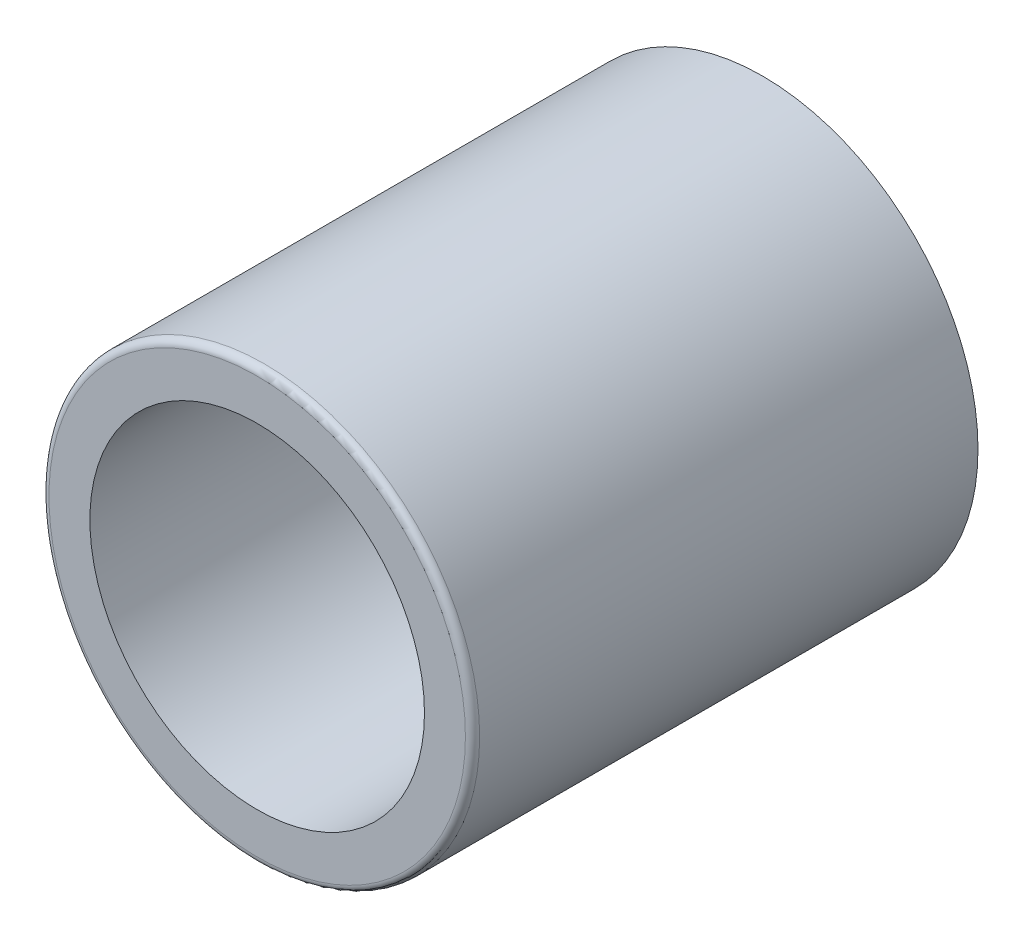
ISO-10303-21;
HEADER;
FILE_DESCRIPTION(('STEP AP214'),'2;1');
FILE_NAME('part.step','',(''),(''),'','','');
FILE_SCHEMA(('AUTOMOTIVE_DESIGN { 1 0 10303 214 1 1 1 1 }'));
ENDSEC;
DATA;
#1=APPLICATION_CONTEXT('core data for automotive mechanical design processes');
#2=APPLICATION_PROTOCOL_DEFINITION('international standard','automotive_design',2000,#1);
#3=PRODUCT_CONTEXT('',#1,'mechanical');
#4=PRODUCT('Part','Part','',(#3));
#5=PRODUCT_RELATED_PRODUCT_CATEGORY('part','',(#4));
#6=PRODUCT_DEFINITION_FORMATION('','',#4);
#7=PRODUCT_DEFINITION_CONTEXT('part definition',#1,'design');
#8=PRODUCT_DEFINITION('design','',#6,#7);
#9=PRODUCT_DEFINITION_SHAPE('','',#8);
#10=(LENGTH_UNIT() NAMED_UNIT(*) SI_UNIT(.MILLI.,.METRE.));
#11=(NAMED_UNIT(*) PLANE_ANGLE_UNIT() SI_UNIT($,.RADIAN.));
#12=(NAMED_UNIT(*) SI_UNIT($,.STERADIAN.) SOLID_ANGLE_UNIT());
#13=UNCERTAINTY_MEASURE_WITH_UNIT(LENGTH_MEASURE(1.E-05),#10,'distance_accuracy_value','');
#14=(GEOMETRIC_REPRESENTATION_CONTEXT(3) GLOBAL_UNCERTAINTY_ASSIGNED_CONTEXT((#13)) GLOBAL_UNIT_ASSIGNED_CONTEXT((#10,
#11,#12)) REPRESENTATION_CONTEXT('',''));
#15=CARTESIAN_POINT('',(0.,0.,0.));
#16=DIRECTION('',(0.,0.,1.));
#17=DIRECTION('',(1.,0.,0.));
#18=AXIS2_PLACEMENT_3D('',#15,#16,#17);
#19=CARTESIAN_POINT('',(0.,0.,14.2));
#20=DIRECTION('',(0.,0.,1.));
#21=DIRECTION('',(1.,0.,0.));
#22=AXIS2_PLACEMENT_3D('',#19,#20,#21);
#23=PLANE('',#22);
#24=CARTESIAN_POINT('',(0.,0.,14.2));
#25=DIRECTION('',(0.,0.,1.));
#26=DIRECTION('',(1.,0.,0.));
#27=AXIS2_PLACEMENT_3D('',#24,#25,#26);
#28=CIRCLE('',#27,5.85);
#29=CARTESIAN_POINT('',(5.85,0.,14.2));
#30=VERTEX_POINT('',#29);
#31=EDGE_CURVE('E41',#30,#30,#28,.T.);
#32=ORIENTED_EDGE('',*,*,#31,.T.);
#33=EDGE_LOOP('',(#32));
#34=FACE_BOUND('',#33,.T.);
#35=CARTESIAN_POINT('',(0.,0.,14.2));
#36=DIRECTION('',(0.,0.,1.));
#37=DIRECTION('',(1.,0.,0.));
#38=AXIS2_PLACEMENT_3D('',#35,#36,#37);
#39=CIRCLE('',#38,4.7);
#40=CARTESIAN_POINT('',(4.7,0.,14.2));
#41=VERTEX_POINT('',#40);
#42=EDGE_CURVE('E49',#41,#41,#39,.T.);
#43=ORIENTED_EDGE('',*,*,#42,.F.);
#44=EDGE_LOOP('',(#43));
#45=FACE_BOUND('',#44,.T.);
#46=ADVANCED_FACE('F34',(#34,#45),#23,.T.);
#47=CARTESIAN_POINT('',(0.,0.,0.));
#48=DIRECTION('',(0.,0.,1.));
#49=DIRECTION('',(1.,0.,0.));
#50=AXIS2_PLACEMENT_3D('',#47,#48,#49);
#51=PLANE('',#50);
#52=CARTESIAN_POINT('',(0.,0.,0.));
#53=DIRECTION('',(0.,0.,1.));
#54=DIRECTION('',(1.,0.,0.));
#55=AXIS2_PLACEMENT_3D('',#52,#53,#54);
#56=CIRCLE('',#55,6.05);
#57=CARTESIAN_POINT('',(6.05,0.,0.));
#58=VERTEX_POINT('',#57);
#59=EDGE_CURVE('E45',#58,#58,#56,.T.);
#60=ORIENTED_EDGE('',*,*,#59,.F.);
#61=EDGE_LOOP('',(#60));
#62=FACE_BOUND('',#61,.T.);
#63=CARTESIAN_POINT('',(0.,0.,0.));
#64=DIRECTION('',(0.,0.,1.));
#65=DIRECTION('',(1.,0.,0.));
#66=AXIS2_PLACEMENT_3D('',#63,#64,#65);
#67=CIRCLE('',#66,4.7);
#68=CARTESIAN_POINT('',(4.7,0.,0.));
#69=VERTEX_POINT('',#68);
#70=EDGE_CURVE('E52',#69,#69,#67,.T.);
#71=ORIENTED_EDGE('',*,*,#70,.T.);
#72=EDGE_LOOP('',(#71));
#73=FACE_BOUND('',#72,.T.);
#74=ADVANCED_FACE('F62',(#62,#73),#51,.F.);
#75=CARTESIAN_POINT('',(0.,0.,14.2));
#76=DIRECTION('',(0.,0.,-1.));
#77=DIRECTION('',(-1.,0.,0.));
#78=AXIS2_PLACEMENT_3D('',#75,#76,#77);
#79=CYLINDRICAL_SURFACE('',#78,6.05);
#80=CARTESIAN_POINT('',(0.,0.,14.));
#81=DIRECTION('',(0.,0.,1.));
#82=DIRECTION('',(1.,0.,0.));
#83=AXIS2_PLACEMENT_3D('',#80,#81,#82);
#84=CIRCLE('',#83,6.05);
#85=CARTESIAN_POINT('',(6.05,0.,14.));
#86=VERTEX_POINT('',#85);
#87=EDGE_CURVE('E10',#86,#86,#84,.F.);
#88=ORIENTED_EDGE('',*,*,#87,.T.);
#89=EDGE_LOOP('',(#88));
#90=FACE_BOUND('',#89,.T.);
#91=ORIENTED_EDGE('',*,*,#59,.T.);
#92=EDGE_LOOP('',(#91));
#93=FACE_BOUND('',#92,.T.);
#94=ADVANCED_FACE('F67',(#90,#93),#79,.T.);
#95=CARTESIAN_POINT('',(0.,0.,14.2));
#96=DIRECTION('',(0.,0.,-1.));
#97=DIRECTION('',(-1.,0.,0.));
#98=AXIS2_PLACEMENT_3D('',#95,#96,#97);
#99=CYLINDRICAL_SURFACE('',#98,4.7);
#100=ORIENTED_EDGE('',*,*,#42,.T.);
#101=EDGE_LOOP('',(#100));
#102=FACE_BOUND('',#101,.T.);
#103=ORIENTED_EDGE('',*,*,#70,.F.);
#104=EDGE_LOOP('',(#103));
#105=FACE_BOUND('',#104,.T.);
#106=ADVANCED_FACE('F58',(#102,#105),#99,.F.);
#107=CARTESIAN_POINT('',(0.,0.,14.));
#108=DIRECTION('',(0.,0.,1.));
#109=DIRECTION('',(1.,0.,0.));
#110=AXIS2_PLACEMENT_3D('',#107,#108,#109);
#111=TOROIDAL_SURFACE('',#110,5.85,0.2);
#112=ORIENTED_EDGE('',*,*,#87,.F.);
#113=EDGE_LOOP('',(#112));
#114=FACE_BOUND('',#113,.T.);
#115=ORIENTED_EDGE('',*,*,#31,.F.);
#116=EDGE_LOOP('',(#115));
#117=FACE_BOUND('',#116,.T.);
#118=ADVANCED_FACE('F36',(#114,#117),#111,.T.);
#119=CLOSED_SHELL('',(#46,#74,#94,#106,#118));
#120=MANIFOLD_SOLID_BREP('B2',#119);
#121=ADVANCED_BREP_SHAPE_REPRESENTATION('',(#18,#120),#14);
#122=SHAPE_DEFINITION_REPRESENTATION(#9,#121);
ENDSEC;
END-ISO-10303-21;
